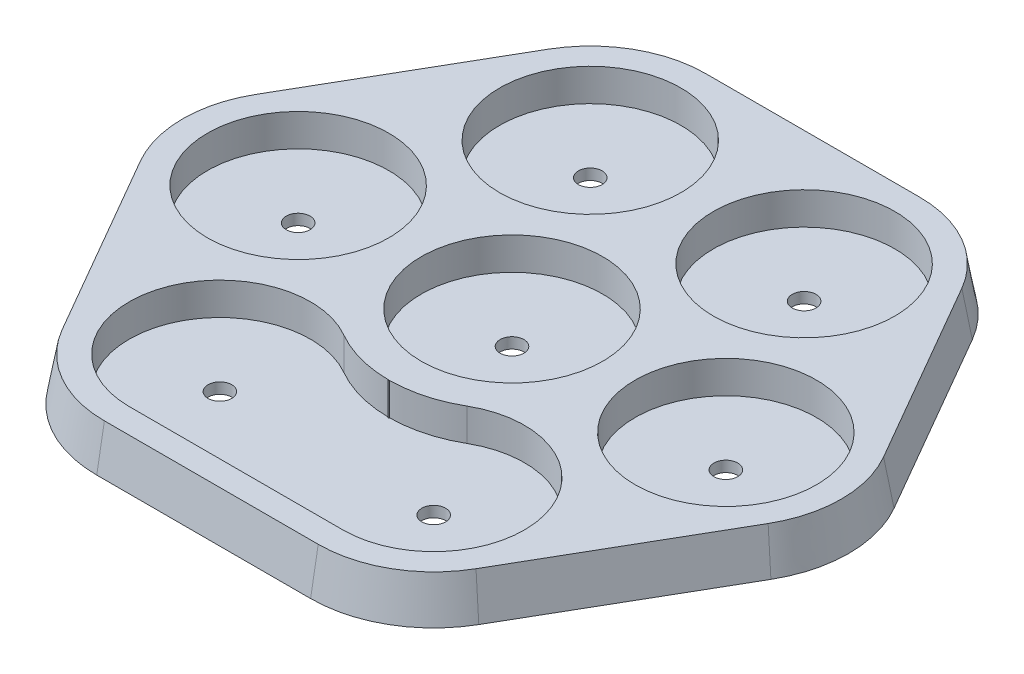
ISO-10303-21;
HEADER;
FILE_DESCRIPTION(('STEP AP214'),'2;1');
FILE_NAME('part.step','',(''),(''),'','','');
FILE_SCHEMA(('AUTOMOTIVE_DESIGN { 1 0 10303 214 1 1 1 1 }'));
ENDSEC;
DATA;
#1=APPLICATION_CONTEXT('core data for automotive mechanical design processes');
#2=APPLICATION_PROTOCOL_DEFINITION('international standard','automotive_design',2000,#1);
#3=PRODUCT_CONTEXT('',#1,'mechanical');
#4=PRODUCT('Part','Part','',(#3));
#5=PRODUCT_RELATED_PRODUCT_CATEGORY('part','',(#4));
#6=PRODUCT_DEFINITION_FORMATION('','',#4);
#7=PRODUCT_DEFINITION_CONTEXT('part definition',#1,'design');
#8=PRODUCT_DEFINITION('design','',#6,#7);
#9=PRODUCT_DEFINITION_SHAPE('','',#8);
#10=(LENGTH_UNIT() NAMED_UNIT(*) SI_UNIT(.MILLI.,.METRE.));
#11=(NAMED_UNIT(*) PLANE_ANGLE_UNIT() SI_UNIT($,.RADIAN.));
#12=(NAMED_UNIT(*) SI_UNIT($,.STERADIAN.) SOLID_ANGLE_UNIT());
#13=UNCERTAINTY_MEASURE_WITH_UNIT(LENGTH_MEASURE(1.E-05),#10,'distance_accuracy_value','');
#14=(GEOMETRIC_REPRESENTATION_CONTEXT(3) GLOBAL_UNCERTAINTY_ASSIGNED_CONTEXT((#13)) GLOBAL_UNIT_ASSIGNED_CONTEXT((#10,
#11,#12)) REPRESENTATION_CONTEXT('',''));
#15=CARTESIAN_POINT('',(0.,0.,0.));
#16=DIRECTION('',(0.,0.,1.));
#17=DIRECTION('',(1.,0.,0.));
#18=AXIS2_PLACEMENT_3D('',#15,#16,#17);
#19=CARTESIAN_POINT('',(0.,4.,0.));
#20=DIRECTION('',(0.,1.,0.));
#21=DIRECTION('',(0.,0.,1.));
#22=AXIS2_PLACEMENT_3D('',#19,#20,#21);
#23=PLANE('',#22);
#24=CARTESIAN_POINT('',(-39.5999999999999,4.,-2.72581957005969E-13));
#25=DIRECTION('',(0.,1.,0.));
#26=DIRECTION('',(0.,0.,1.));
#27=AXIS2_PLACEMENT_3D('',#24,#25,#26);
#28=CIRCLE('',#27,10.6946920771662);
#29=CARTESIAN_POINT('',(-48.8618750244777,4.,-5.34734603858365));
#30=VERTEX_POINT('',#29);
#31=CARTESIAN_POINT('',(-48.8618750244779,4.,5.3473460385827));
#32=VERTEX_POINT('',#31);
#33=EDGE_CURVE('E422',#30,#32,#28,.T.);
#34=ORIENTED_EDGE('',*,*,#33,.T.);
#35=DIRECTION('',(-0.499999999999992,0.,-0.866025403784443));
#36=VECTOR('',#35,1.);
#37=CARTESIAN_POINT('',(-38.9618750244782,4.,22.4946490335146));
#38=LINE('',#37,#36);
#39=CARTESIAN_POINT('',(-38.961875024478,4.,22.4946490335148));
#40=VERTEX_POINT('',#39);
#41=EDGE_CURVE('E463',#32,#40,#38,.F.);
#42=ORIENTED_EDGE('',*,*,#41,.T.);
#43=CARTESIAN_POINT('',(-29.6999999999999,4.,17.1473029949318));
#44=DIRECTION('',(0.,1.,0.));
#45=DIRECTION('',(0.,0.,1.));
#46=AXIS2_PLACEMENT_3D('',#43,#44,#45);
#47=CIRCLE('',#46,10.6946920771661);
#48=CARTESIAN_POINT('',(-29.6999999999999,4.,27.841995072098));
#49=VERTEX_POINT('',#48);
#50=EDGE_CURVE('E466',#40,#49,#47,.T.);
#51=ORIENTED_EDGE('',*,*,#50,.T.);
#52=DIRECTION('',(-1.,0.,0.));
#53=VECTOR('',#52,1.);
#54=CARTESIAN_POINT('',(0.,4.,27.841995072098));
#55=LINE('',#54,#53);
#56=CARTESIAN_POINT('',(-9.90000000000008,4.,27.841995072098));
#57=VERTEX_POINT('',#56);
#58=EDGE_CURVE('E469',#57,#49,#55,.T.);
#59=ORIENTED_EDGE('',*,*,#58,.F.);
#60=CARTESIAN_POINT('',(-9.90000000000008,4.,17.1473029949318));
#61=DIRECTION('',(0.,1.,0.));
#62=DIRECTION('',(0.,0.,1.));
#63=AXIS2_PLACEMENT_3D('',#60,#61,#62);
#64=CIRCLE('',#63,10.6946920771661);
#65=CARTESIAN_POINT('',(-0.63812497552206,4.,22.494649033515));
#66=VERTEX_POINT('',#65);
#67=EDGE_CURVE('E473',#57,#66,#64,.T.);
#68=ORIENTED_EDGE('',*,*,#67,.T.);
#69=DIRECTION('',(-0.500000000000004,0.,0.866025403784436));
#70=VECTOR('',#69,1.);
#71=CARTESIAN_POINT('',(9.26187502447802,4.,5.34734603858312));
#72=LINE('',#71,#70);
#73=CARTESIAN_POINT('',(9.26187502447802,4.,5.34734603858311));
#74=VERTEX_POINT('',#73);
#75=EDGE_CURVE('E476',#74,#66,#72,.T.);
#76=ORIENTED_EDGE('',*,*,#75,.F.);
#77=CARTESIAN_POINT('',(0.,4.,0.));
#78=DIRECTION('',(0.,1.,0.));
#79=DIRECTION('',(0.,0.,1.));
#80=AXIS2_PLACEMENT_3D('',#77,#78,#79);
#81=CIRCLE('',#80,10.6946920771661);
#82=CARTESIAN_POINT('',(9.26187502447801,4.,-5.34734603858311));
#83=VERTEX_POINT('',#82);
#84=EDGE_CURVE('E480',#74,#83,#81,.T.);
#85=ORIENTED_EDGE('',*,*,#84,.T.);
#86=DIRECTION('',(0.500000000000004,0.,0.866025403784436));
#87=VECTOR('',#86,1.);
#88=CARTESIAN_POINT('',(9.26187502447801,4.,-5.34734603858311));
#89=LINE('',#88,#87);
#90=CARTESIAN_POINT('',(-0.638124975521912,4.,-22.4946490335147));
#91=VERTEX_POINT('',#90);
#92=EDGE_CURVE('E483',#91,#83,#89,.T.);
#93=ORIENTED_EDGE('',*,*,#92,.F.);
#94=CARTESIAN_POINT('',(-9.89999999999992,4.,-17.1473029949316));
#95=DIRECTION('',(0.,1.,0.));
#96=DIRECTION('',(0.,0.,1.));
#97=AXIS2_PLACEMENT_3D('',#94,#95,#96);
#98=CIRCLE('',#97,10.6946920771661);
#99=CARTESIAN_POINT('',(-9.89999999999993,4.,-27.8419950720977));
#100=VERTEX_POINT('',#99);
#101=EDGE_CURVE('E487',#91,#100,#98,.T.);
#102=ORIENTED_EDGE('',*,*,#101,.T.);
#103=DIRECTION('',(1.,0.,0.));
#104=VECTOR('',#103,1.);
#105=CARTESIAN_POINT('',(2.04901295325575E-13,4.,-27.8419950720976));
#106=LINE('',#105,#104);
#107=CARTESIAN_POINT('',(-29.6999999999993,4.,-27.8419950720978));
#108=VERTEX_POINT('',#107);
#109=EDGE_CURVE('E490',#100,#108,#106,.F.);
#110=ORIENTED_EDGE('',*,*,#109,.T.);
#111=CARTESIAN_POINT('',(-29.6999999999994,4.,-17.1473029949317));
#112=DIRECTION('',(0.,1.,0.));
#113=DIRECTION('',(0.,0.,1.));
#114=AXIS2_PLACEMENT_3D('',#111,#112,#113);
#115=CIRCLE('',#114,10.6946920771661);
#116=CARTESIAN_POINT('',(-38.9618750244772,4.,-22.4946490335151));
#117=VERTEX_POINT('',#116);
#118=EDGE_CURVE('E492',#108,#117,#115,.T.);
#119=ORIENTED_EDGE('',*,*,#118,.T.);
#120=DIRECTION('',(0.500000000000028,0.,-0.866025403784422));
#121=VECTOR('',#120,1.);
#122=CARTESIAN_POINT('',(-38.9618750244768,4.,-22.4946490335159));
#123=LINE('',#122,#121);
#124=EDGE_CURVE('E123',#117,#30,#123,.F.);
#125=ORIENTED_EDGE('',*,*,#124,.T.);
#126=EDGE_LOOP('',(#34,#42,#51,#59,#68,#76,#85,#93,#102,#110,#119,#125));
#127=FACE_BOUND('',#126,.T.);
#128=CARTESIAN_POINT('',(-19.7999999999998,4.,0.));
#129=DIRECTION('',(0.,1.,0.));
#130=DIRECTION('',(0.,0.,1.));
#131=AXIS2_PLACEMENT_3D('',#128,#129,#130);
#132=CIRCLE('',#131,8.40000000000001);
#133=CARTESIAN_POINT('',(-19.7999999999998,4.,8.40000000000001));
#134=VERTEX_POINT('',#133);
#135=EDGE_CURVE('E343',#134,#134,#132,.T.);
#136=ORIENTED_EDGE('',*,*,#135,.F.);
#137=EDGE_LOOP('',(#136));
#138=FACE_BOUND('',#137,.T.);
#139=CARTESIAN_POINT('',(0.,4.,0.));
#140=DIRECTION('',(0.,1.,0.));
#141=DIRECTION('',(0.,0.,1.));
#142=AXIS2_PLACEMENT_3D('',#139,#140,#141);
#143=CIRCLE('',#142,8.4);
#144=CARTESIAN_POINT('',(0.,4.,8.4));
#145=VERTEX_POINT('',#144);
#146=EDGE_CURVE('E667',#145,#145,#143,.T.);
#147=ORIENTED_EDGE('',*,*,#146,.F.);
#148=EDGE_LOOP('',(#147));
#149=FACE_BOUND('',#148,.T.);
#150=CARTESIAN_POINT('',(-39.5999999999999,4.,-2.72581957005969E-13));
#151=DIRECTION('',(0.,1.,0.));
#152=DIRECTION('',(0.,0.,1.));
#153=AXIS2_PLACEMENT_3D('',#150,#151,#152);
#154=CIRCLE('',#153,8.40000000000002);
#155=CARTESIAN_POINT('',(-39.5999999999999,4.,8.39999999999974));
#156=VERTEX_POINT('',#155);
#157=EDGE_CURVE('E678',#156,#156,#154,.T.);
#158=ORIENTED_EDGE('',*,*,#157,.F.);
#159=EDGE_LOOP('',(#158));
#160=FACE_BOUND('',#159,.T.);
#161=CARTESIAN_POINT('',(-9.89999999999992,4.,-17.1473029949316));
#162=DIRECTION('',(0.,1.,0.));
#163=DIRECTION('',(0.,0.,1.));
#164=AXIS2_PLACEMENT_3D('',#161,#162,#163);
#165=CIRCLE('',#164,8.4);
#166=CARTESIAN_POINT('',(-9.89999999999992,4.,-8.74730299493156));
#167=VERTEX_POINT('',#166);
#168=EDGE_CURVE('E691',#167,#167,#165,.T.);
#169=ORIENTED_EDGE('',*,*,#168,.F.);
#170=EDGE_LOOP('',(#169));
#171=FACE_BOUND('',#170,.T.);
#172=CARTESIAN_POINT('',(-29.6999999999994,4.,-17.1473029949317));
#173=DIRECTION('',(0.,1.,0.));
#174=DIRECTION('',(0.,0.,1.));
#175=AXIS2_PLACEMENT_3D('',#172,#173,#174);
#176=CIRCLE('',#175,8.39999999999999);
#177=CARTESIAN_POINT('',(-29.6999999999994,4.,-8.74730299493172));
#178=VERTEX_POINT('',#177);
#179=EDGE_CURVE('E702',#178,#178,#176,.T.);
#180=ORIENTED_EDGE('',*,*,#179,.F.);
#181=EDGE_LOOP('',(#180));
#182=FACE_BOUND('',#181,.T.);
#183=CARTESIAN_POINT('',(-29.6999999999999,4.,17.1473029949318));
#184=DIRECTION('',(0.,1.,0.));
#185=DIRECTION('',(0.,0.,1.));
#186=AXIS2_PLACEMENT_3D('',#183,#184,#185);
#187=CIRCLE('',#186,8.4);
#188=CARTESIAN_POINT('',(-25.4999999999999,4.,9.87268960314258));
#189=VERTEX_POINT('',#188);
#190=CARTESIAN_POINT('',(-29.6999999999999,4.,25.5473029949318));
#191=VERTEX_POINT('',#190);
#192=EDGE_CURVE('E263',#189,#191,#187,.T.);
#193=ORIENTED_EDGE('',*,*,#192,.F.);
#194=CARTESIAN_POINT('',(-19.7999999999998,4.,0.));
#195=DIRECTION('',(0.,1.,0.));
#196=DIRECTION('',(0.,0.,1.));
#197=AXIS2_PLACEMENT_3D('',#194,#195,#196);
#198=CIRCLE('',#197,11.4);
#199=CARTESIAN_POINT('',(-19.8548493383757,4.,11.3998680496785));
#200=VERTEX_POINT('',#199);
#201=EDGE_CURVE('E137',#189,#200,#198,.T.);
#202=ORIENTED_EDGE('',*,*,#201,.T.);
#203=CARTESIAN_POINT('',(-29.6999999999999,4.,17.1473029949318));
#204=DIRECTION('',(0.,1.,0.));
#205=DIRECTION('',(0.,0.,1.));
#206=AXIS2_PLACEMENT_3D('',#203,#204,#205);
#207=CIRCLE('',#206,11.4);
#208=CARTESIAN_POINT('',(-19.8,4.,11.4948698905067));
#209=VERTEX_POINT('',#208);
#210=EDGE_CURVE('E270',#209,#200,#207,.T.);
#211=ORIENTED_EDGE('',*,*,#210,.F.);
#212=CARTESIAN_POINT('',(-9.90000000000008,4.,17.1473029949318));
#213=DIRECTION('',(0.,1.,0.));
#214=DIRECTION('',(0.,0.,1.));
#215=AXIS2_PLACEMENT_3D('',#212,#213,#214);
#216=CIRCLE('',#215,11.4);
#217=CARTESIAN_POINT('',(-19.7451506616243,4.,11.3998680496785));
#218=VERTEX_POINT('',#217);
#219=EDGE_CURVE('E304',#218,#209,#216,.T.);
#220=ORIENTED_EDGE('',*,*,#219,.F.);
#221=CARTESIAN_POINT('',(-19.7999999999998,4.,0.));
#222=DIRECTION('',(0.,1.,0.));
#223=DIRECTION('',(0.,0.,1.));
#224=AXIS2_PLACEMENT_3D('',#221,#222,#223);
#225=CIRCLE('',#224,11.4);
#226=CARTESIAN_POINT('',(-14.0999999999999,4.,9.87268960314266));
#227=VERTEX_POINT('',#226);
#228=EDGE_CURVE('E308',#218,#227,#225,.T.);
#229=ORIENTED_EDGE('',*,*,#228,.T.);
#230=CARTESIAN_POINT('',(-9.90000000000008,4.,17.1473029949318));
#231=DIRECTION('',(0.,1.,0.));
#232=DIRECTION('',(0.,0.,1.));
#233=AXIS2_PLACEMENT_3D('',#230,#231,#232);
#234=CIRCLE('',#233,8.4);
#235=CARTESIAN_POINT('',(-9.90000000000008,4.,25.5473029949318));
#236=VERTEX_POINT('',#235);
#237=EDGE_CURVE('E312',#236,#227,#234,.T.);
#238=ORIENTED_EDGE('',*,*,#237,.F.);
#239=DIRECTION('',(1.,0.,0.));
#240=VECTOR('',#239,1.);
#241=CARTESIAN_POINT('',(0.,4.,25.5473029949319));
#242=LINE('',#241,#240);
#243=EDGE_CURVE('E316',#191,#236,#242,.T.);
#244=ORIENTED_EDGE('',*,*,#243,.F.);
#245=EDGE_LOOP('',(#193,#202,#211,#220,#229,#238,#244));
#246=FACE_BOUND('',#245,.T.);
#247=ADVANCED_FACE('F119',(#127,#138,#149,#160,#171,#182,#246),#23,.T.);
#248=CARTESIAN_POINT('',(-9.90000000000008,0.,17.1473029949318));
#249=DIRECTION('',(0.,1.,0.));
#250=DIRECTION('',(0.,0.,1.));
#251=AXIS2_PLACEMENT_3D('',#248,#249,#250);
#252=CYLINDRICAL_SURFACE('',#251,1.1);
#253=CARTESIAN_POINT('',(-9.90000000000008,0.,17.1473029949318));
#254=DIRECTION('',(0.,1.,0.));
#255=DIRECTION('',(0.,0.,1.));
#256=AXIS2_PLACEMENT_3D('',#253,#254,#255);
#257=CIRCLE('',#256,1.1);
#258=CARTESIAN_POINT('',(-9.90000000000008,0.,18.2473029949318));
#259=VERTEX_POINT('',#258);
#260=EDGE_CURVE('E373',#259,#259,#257,.T.);
#261=ORIENTED_EDGE('',*,*,#260,.F.);
#262=EDGE_LOOP('',(#261));
#263=FACE_BOUND('',#262,.T.);
#264=CARTESIAN_POINT('',(-9.90000000000008,1.,17.1473029949318));
#265=DIRECTION('',(0.,1.,0.));
#266=DIRECTION('',(0.,0.,1.));
#267=AXIS2_PLACEMENT_3D('',#264,#265,#266);
#268=CIRCLE('',#267,1.1);
#269=CARTESIAN_POINT('',(-9.90000000000008,1.,18.2473029949318));
#270=VERTEX_POINT('',#269);
#271=EDGE_CURVE('E709',#270,#270,#268,.T.);
#272=ORIENTED_EDGE('',*,*,#271,.T.);
#273=EDGE_LOOP('',(#272));
#274=FACE_BOUND('',#273,.T.);
#275=ADVANCED_FACE('F566',(#263,#274),#252,.F.);
#276=CARTESIAN_POINT('',(-19.7999999999998,0.,0.));
#277=DIRECTION('',(0.,1.,0.));
#278=DIRECTION('',(0.,0.,1.));
#279=AXIS2_PLACEMENT_3D('',#276,#277,#278);
#280=CYLINDRICAL_SURFACE('',#279,1.10000000000001);
#281=CARTESIAN_POINT('',(-19.7999999999998,0.,0.));
#282=DIRECTION('',(0.,1.,0.));
#283=DIRECTION('',(0.,0.,1.));
#284=AXIS2_PLACEMENT_3D('',#281,#282,#283);
#285=CIRCLE('',#284,1.10000000000001);
#286=CARTESIAN_POINT('',(-19.7999999999998,0.,1.10000000000001));
#287=VERTEX_POINT('',#286);
#288=EDGE_CURVE('E349',#287,#287,#285,.T.);
#289=ORIENTED_EDGE('',*,*,#288,.F.);
#290=EDGE_LOOP('',(#289));
#291=FACE_BOUND('',#290,.T.);
#292=CARTESIAN_POINT('',(-19.7999999999998,1.,0.));
#293=DIRECTION('',(0.,1.,0.));
#294=DIRECTION('',(0.,0.,1.));
#295=AXIS2_PLACEMENT_3D('',#292,#293,#294);
#296=CIRCLE('',#295,1.10000000000001);
#297=CARTESIAN_POINT('',(-19.7999999999998,1.,1.10000000000001));
#298=VERTEX_POINT('',#297);
#299=EDGE_CURVE('E339',#298,#298,#296,.T.);
#300=ORIENTED_EDGE('',*,*,#299,.T.);
#301=EDGE_LOOP('',(#300));
#302=FACE_BOUND('',#301,.T.);
#303=ADVANCED_FACE('F570',(#291,#302),#280,.F.);
#304=CARTESIAN_POINT('',(-29.6999999999994,0.,-17.1473029949317));
#305=DIRECTION('',(0.,1.,0.));
#306=DIRECTION('',(0.,0.,1.));
#307=AXIS2_PLACEMENT_3D('',#304,#305,#306);
#308=CYLINDRICAL_SURFACE('',#307,1.1);
#309=CARTESIAN_POINT('',(-29.6999999999994,0.,-17.1473029949317));
#310=DIRECTION('',(0.,1.,0.));
#311=DIRECTION('',(0.,0.,1.));
#312=AXIS2_PLACEMENT_3D('',#309,#310,#311);
#313=CIRCLE('',#312,1.1);
#314=CARTESIAN_POINT('',(-29.6999999999994,0.,-16.0473029949317));
#315=VERTEX_POINT('',#314);
#316=EDGE_CURVE('E353',#315,#315,#313,.T.);
#317=ORIENTED_EDGE('',*,*,#316,.F.);
#318=EDGE_LOOP('',(#317));
#319=FACE_BOUND('',#318,.T.);
#320=CARTESIAN_POINT('',(-29.6999999999994,1.,-17.1473029949317));
#321=DIRECTION('',(0.,1.,0.));
#322=DIRECTION('',(0.,0.,1.));
#323=AXIS2_PLACEMENT_3D('',#320,#321,#322);
#324=CIRCLE('',#323,1.1);
#325=CARTESIAN_POINT('',(-29.6999999999994,1.,-16.0473029949317));
#326=VERTEX_POINT('',#325);
#327=EDGE_CURVE('E272',#326,#326,#324,.T.);
#328=ORIENTED_EDGE('',*,*,#327,.T.);
#329=EDGE_LOOP('',(#328));
#330=FACE_BOUND('',#329,.T.);
#331=ADVANCED_FACE('F582',(#319,#330),#308,.F.);
#332=CARTESIAN_POINT('',(0.,0.,0.));
#333=DIRECTION('',(0.,1.,0.));
#334=DIRECTION('',(0.,0.,1.));
#335=AXIS2_PLACEMENT_3D('',#332,#333,#334);
#336=CYLINDRICAL_SURFACE('',#335,1.1);
#337=CARTESIAN_POINT('',(0.,0.,0.));
#338=DIRECTION('',(0.,1.,0.));
#339=DIRECTION('',(0.,0.,1.));
#340=AXIS2_PLACEMENT_3D('',#337,#338,#339);
#341=CIRCLE('',#340,1.1);
#342=CARTESIAN_POINT('',(0.,0.,1.1));
#343=VERTEX_POINT('',#342);
#344=EDGE_CURVE('E369',#343,#343,#341,.T.);
#345=ORIENTED_EDGE('',*,*,#344,.F.);
#346=EDGE_LOOP('',(#345));
#347=FACE_BOUND('',#346,.T.);
#348=CARTESIAN_POINT('',(0.,1.,0.));
#349=DIRECTION('',(0.,1.,0.));
#350=DIRECTION('',(0.,0.,1.));
#351=AXIS2_PLACEMENT_3D('',#348,#349,#350);
#352=CIRCLE('',#351,1.1);
#353=CARTESIAN_POINT('',(0.,1.,1.1));
#354=VERTEX_POINT('',#353);
#355=EDGE_CURVE('E663',#354,#354,#352,.T.);
#356=ORIENTED_EDGE('',*,*,#355,.T.);
#357=EDGE_LOOP('',(#356));
#358=FACE_BOUND('',#357,.T.);
#359=ADVANCED_FACE('F578',(#347,#358),#336,.F.);
#360=CARTESIAN_POINT('',(-29.6999999999999,0.,17.1473029949318));
#361=DIRECTION('',(0.,1.,0.));
#362=DIRECTION('',(0.,0.,1.));
#363=AXIS2_PLACEMENT_3D('',#360,#361,#362);
#364=CYLINDRICAL_SURFACE('',#363,1.1);
#365=CARTESIAN_POINT('',(-29.6999999999999,0.,17.1473029949318));
#366=DIRECTION('',(0.,1.,0.));
#367=DIRECTION('',(0.,0.,1.));
#368=AXIS2_PLACEMENT_3D('',#365,#366,#367);
#369=CIRCLE('',#368,1.1);
#370=CARTESIAN_POINT('',(-29.6999999999999,0.,18.2473029949318));
#371=VERTEX_POINT('',#370);
#372=EDGE_CURVE('E365',#371,#371,#369,.T.);
#373=ORIENTED_EDGE('',*,*,#372,.F.);
#374=EDGE_LOOP('',(#373));
#375=FACE_BOUND('',#374,.T.);
#376=CARTESIAN_POINT('',(-29.6999999999999,1.,17.1473029949318));
#377=DIRECTION('',(0.,1.,0.));
#378=DIRECTION('',(0.,0.,1.));
#379=AXIS2_PLACEMENT_3D('',#376,#377,#378);
#380=CIRCLE('',#379,1.1);
#381=CARTESIAN_POINT('',(-29.6999999999999,1.,18.2473029949318));
#382=VERTEX_POINT('',#381);
#383=EDGE_CURVE('E301',#382,#382,#380,.T.);
#384=ORIENTED_EDGE('',*,*,#383,.T.);
#385=EDGE_LOOP('',(#384));
#386=FACE_BOUND('',#385,.T.);
#387=ADVANCED_FACE('F574',(#375,#386),#364,.F.);
#388=CARTESIAN_POINT('',(-39.5999999999999,0.,-2.72581957005969E-13));
#389=DIRECTION('',(0.,1.,0.));
#390=DIRECTION('',(0.,0.,1.));
#391=AXIS2_PLACEMENT_3D('',#388,#389,#390);
#392=CYLINDRICAL_SURFACE('',#391,1.10000000000001);
#393=CARTESIAN_POINT('',(-39.5999999999999,0.,-2.72581957005969E-13));
#394=DIRECTION('',(0.,1.,0.));
#395=DIRECTION('',(0.,0.,1.));
#396=AXIS2_PLACEMENT_3D('',#393,#394,#395);
#397=CIRCLE('',#396,1.10000000000001);
#398=CARTESIAN_POINT('',(-39.5999999999999,0.,1.09999999999974));
#399=VERTEX_POINT('',#398);
#400=EDGE_CURVE('E361',#399,#399,#397,.T.);
#401=ORIENTED_EDGE('',*,*,#400,.F.);
#402=EDGE_LOOP('',(#401));
#403=FACE_BOUND('',#402,.T.);
#404=CARTESIAN_POINT('',(-39.5999999999999,1.,-2.72581957005969E-13));
#405=DIRECTION('',(0.,1.,0.));
#406=DIRECTION('',(0.,0.,1.));
#407=AXIS2_PLACEMENT_3D('',#404,#405,#406);
#408=CIRCLE('',#407,1.10000000000001);
#409=CARTESIAN_POINT('',(-39.5999999999999,1.,1.09999999999974));
#410=VERTEX_POINT('',#409);
#411=EDGE_CURVE('E674',#410,#410,#408,.T.);
#412=ORIENTED_EDGE('',*,*,#411,.T.);
#413=EDGE_LOOP('',(#412));
#414=FACE_BOUND('',#413,.T.);
#415=ADVANCED_FACE('F577',(#403,#414),#392,.F.);
#416=CARTESIAN_POINT('',(-9.89999999999992,0.,-17.1473029949316));
#417=DIRECTION('',(0.,1.,0.));
#418=DIRECTION('',(0.,0.,1.));
#419=AXIS2_PLACEMENT_3D('',#416,#417,#418);
#420=CYLINDRICAL_SURFACE('',#419,1.1);
#421=CARTESIAN_POINT('',(-9.89999999999992,0.,-17.1473029949316));
#422=DIRECTION('',(0.,1.,0.));
#423=DIRECTION('',(0.,0.,1.));
#424=AXIS2_PLACEMENT_3D('',#421,#422,#423);
#425=CIRCLE('',#424,1.1);
#426=CARTESIAN_POINT('',(-9.89999999999992,0.,-16.0473029949316));
#427=VERTEX_POINT('',#426);
#428=EDGE_CURVE('E357',#427,#427,#425,.T.);
#429=ORIENTED_EDGE('',*,*,#428,.F.);
#430=EDGE_LOOP('',(#429));
#431=FACE_BOUND('',#430,.T.);
#432=CARTESIAN_POINT('',(-9.89999999999992,1.,-17.1473029949316));
#433=DIRECTION('',(0.,1.,0.));
#434=DIRECTION('',(0.,0.,1.));
#435=AXIS2_PLACEMENT_3D('',#432,#433,#434);
#436=CIRCLE('',#435,1.1);
#437=CARTESIAN_POINT('',(-9.89999999999992,1.,-16.0473029949316));
#438=VERTEX_POINT('',#437);
#439=EDGE_CURVE('E687',#438,#438,#436,.T.);
#440=ORIENTED_EDGE('',*,*,#439,.T.);
#441=EDGE_LOOP('',(#440));
#442=FACE_BOUND('',#441,.T.);
#443=ADVANCED_FACE('F584',(#431,#442),#420,.F.);
#444=CARTESIAN_POINT('',(-39.5999999999999,0.,-2.72581957005969E-13));
#445=DIRECTION('',(0.,-1.,0.));
#446=DIRECTION('',(0.,0.,1.));
#447=AXIS2_PLACEMENT_3D('',#444,#445,#446);
#448=CONICAL_SURFACE('',#447,11.4,0.174532925199433);
#449=CARTESIAN_POINT('',(-39.5999999999999,0.,-2.72581957005969E-13));
#450=DIRECTION('',(0.,1.,0.));
#451=DIRECTION('',(0.,0.,1.));
#452=AXIS2_PLACEMENT_3D('',#449,#450,#451);
#453=CIRCLE('',#452,11.4);
#454=CARTESIAN_POINT('',(-49.4726896031423,0.,-5.7000000000006));
#455=VERTEX_POINT('',#454);
#456=CARTESIAN_POINT('',(-49.4726896031425,0.,5.69999999999964));
#457=VERTEX_POINT('',#456);
#458=EDGE_CURVE('E380',#455,#457,#453,.T.);
#459=ORIENTED_EDGE('',*,*,#458,.T.);
#460=DIRECTION('',(-0.150383733180436,-0.984807753012208,0.086824088833464));
#461=VECTOR('',#460,1.);
#462=CARTESIAN_POINT('',(-49.4726896031425,0.,5.69999999999963));
#463=LINE('',#462,#461);
#464=EDGE_CURVE('E12',#32,#457,#463,.T.);
#465=ORIENTED_EDGE('',*,*,#464,.F.);
#466=ORIENTED_EDGE('',*,*,#33,.F.);
#467=DIRECTION('',(-0.150383733180433,-0.984807753012208,-0.0868240888334703));
#468=VECTOR('',#467,1.);
#469=CARTESIAN_POINT('',(-49.4726896031423,0.,-5.7000000000006));
#470=LINE('',#469,#468);
#471=EDGE_CURVE('E424',#30,#455,#470,.T.);
#472=ORIENTED_EDGE('',*,*,#471,.T.);
#473=EDGE_LOOP('',(#459,#465,#466,#472));
#474=FACE_BOUND('',#473,.T.);
#475=ADVANCED_FACE('F510',(#474),#448,.T.);
#476=CARTESIAN_POINT('',(-39.5726896031427,0.,22.8473029949315));
#477=DIRECTION('',(-0.852868531952448,0.173648177666931,0.492403876506096));
#478=DIRECTION('',(0.499999999999992,0.,0.866025403784443));
#479=AXIS2_PLACEMENT_3D('',#476,#477,#478);
#480=PLANE('',#479);
#481=DIRECTION('',(0.499999999999992,0.,0.866025403784443));
#482=VECTOR('',#481,1.);
#483=CARTESIAN_POINT('',(-39.5726896031427,0.,22.8473029949315));
#484=LINE('',#483,#482);
#485=CARTESIAN_POINT('',(-39.5726896031426,0.,22.8473029949318));
#486=VERTEX_POINT('',#485);
#487=EDGE_CURVE('E384',#457,#486,#484,.T.);
#488=ORIENTED_EDGE('',*,*,#487,.T.);
#489=DIRECTION('',(-0.150383733180436,-0.984807753012208,0.086824088833464));
#490=VECTOR('',#489,1.);
#491=CARTESIAN_POINT('',(-39.5726896031426,0.,22.8473029949318));
#492=LINE('',#491,#490);
#493=EDGE_CURVE('E129',#40,#486,#492,.T.);
#494=ORIENTED_EDGE('',*,*,#493,.F.);
#495=ORIENTED_EDGE('',*,*,#41,.F.);
#496=ORIENTED_EDGE('',*,*,#464,.T.);
#497=EDGE_LOOP('',(#488,#494,#495,#496));
#498=FACE_BOUND('',#497,.T.);
#499=ADVANCED_FACE('F121',(#498),#480,.T.);
#500=CARTESIAN_POINT('',(-29.6999999999999,0.,17.1473029949318));
#501=DIRECTION('',(0.,-1.,0.));
#502=DIRECTION('',(0.,0.,1.));
#503=AXIS2_PLACEMENT_3D('',#500,#501,#502);
#504=CONICAL_SURFACE('',#503,11.4,0.174532925199433);
#505=CARTESIAN_POINT('',(-29.6999999999999,0.,17.1473029949318));
#506=DIRECTION('',(0.,1.,0.));
#507=DIRECTION('',(0.,0.,1.));
#508=AXIS2_PLACEMENT_3D('',#505,#506,#507);
#509=CIRCLE('',#508,11.4);
#510=CARTESIAN_POINT('',(-29.6999999999999,0.,28.5473029949318));
#511=VERTEX_POINT('',#510);
#512=EDGE_CURVE('E387',#486,#511,#509,.T.);
#513=ORIENTED_EDGE('',*,*,#512,.T.);
#514=DIRECTION('',(0.,-0.984807753012208,0.173648177666931));
#515=VECTOR('',#514,1.);
#516=CARTESIAN_POINT('',(-29.6999999999999,0.,28.5473029949318));
#517=LINE('',#516,#515);
#518=EDGE_CURVE('E455',#49,#511,#517,.T.);
#519=ORIENTED_EDGE('',*,*,#518,.F.);
#520=ORIENTED_EDGE('',*,*,#50,.F.);
#521=ORIENTED_EDGE('',*,*,#493,.T.);
#522=EDGE_LOOP('',(#513,#519,#520,#521));
#523=FACE_BOUND('',#522,.T.);
#524=ADVANCED_FACE('F518',(#523),#504,.T.);
#525=CARTESIAN_POINT('',(0.,0.,28.5473029949318));
#526=DIRECTION('',(0.,0.173648177666931,0.984807753012208));
#527=DIRECTION('',(0.,-0.984807753012208,0.173648177666931));
#528=AXIS2_PLACEMENT_3D('',#525,#526,#527);
#529=PLANE('',#528);
#530=DIRECTION('',(-1.,0.,0.));
#531=VECTOR('',#530,1.);
#532=CARTESIAN_POINT('',(0.,0.,28.5473029949318));
#533=LINE('',#532,#531);
#534=CARTESIAN_POINT('',(-9.90000000000008,0.,28.5473029949318));
#535=VERTEX_POINT('',#534);
#536=EDGE_CURVE('E391',#535,#511,#533,.T.);
#537=ORIENTED_EDGE('',*,*,#536,.F.);
#538=DIRECTION('',(0.,-0.984807753012208,0.173648177666931));
#539=VECTOR('',#538,1.);
#540=CARTESIAN_POINT('',(-9.90000000000008,0.,28.5473029949318));
#541=LINE('',#540,#539);
#542=EDGE_CURVE('E452',#57,#535,#541,.T.);
#543=ORIENTED_EDGE('',*,*,#542,.F.);
#544=ORIENTED_EDGE('',*,*,#58,.T.);
#545=ORIENTED_EDGE('',*,*,#518,.T.);
#546=EDGE_LOOP('',(#537,#543,#544,#545));
#547=FACE_BOUND('',#546,.T.);
#548=ADVANCED_FACE('F521',(#547),#529,.T.);
#549=CARTESIAN_POINT('',(-9.90000000000008,0.,17.1473029949318));
#550=DIRECTION('',(0.,-1.,0.));
#551=DIRECTION('',(0.,0.,1.));
#552=AXIS2_PLACEMENT_3D('',#549,#550,#551);
#553=CONICAL_SURFACE('',#552,11.4,0.174532925199433);
#554=CARTESIAN_POINT('',(-9.90000000000008,0.,17.1473029949318));
#555=DIRECTION('',(0.,1.,0.));
#556=DIRECTION('',(0.,0.,1.));
#557=AXIS2_PLACEMENT_3D('',#554,#555,#556);
#558=CIRCLE('',#557,11.4);
#559=CARTESIAN_POINT('',(-0.0273103968575052,0.,22.8473029949319));
#560=VERTEX_POINT('',#559);
#561=EDGE_CURVE('E395',#535,#560,#558,.T.);
#562=ORIENTED_EDGE('',*,*,#561,.T.);
#563=DIRECTION('',(0.150383733180435,-0.984807753012208,0.0868240888334661));
#564=VECTOR('',#563,1.);
#565=CARTESIAN_POINT('',(-0.0273103968575027,0.,22.8473029949319));
#566=LINE('',#565,#564);
#567=EDGE_CURVE('E449',#66,#560,#566,.T.);
#568=ORIENTED_EDGE('',*,*,#567,.F.);
#569=ORIENTED_EDGE('',*,*,#67,.F.);
#570=ORIENTED_EDGE('',*,*,#542,.T.);
#571=EDGE_LOOP('',(#562,#568,#569,#570));
#572=FACE_BOUND('',#571,.T.);
#573=ADVANCED_FACE('F526',(#572),#553,.T.);
#574=CARTESIAN_POINT('',(9.87268960314258,0.,5.70000000000005));
#575=DIRECTION('',(0.852868531952441,0.173648177666931,0.492403876506108));
#576=DIRECTION('',(0.500000000000004,0.,-0.866025403784436));
#577=AXIS2_PLACEMENT_3D('',#574,#575,#576);
#578=PLANE('',#577);
#579=DIRECTION('',(-0.500000000000004,0.,0.866025403784436));
#580=VECTOR('',#579,1.);
#581=CARTESIAN_POINT('',(9.87268960314258,0.,5.70000000000005));
#582=LINE('',#581,#580);
#583=CARTESIAN_POINT('',(9.87268960314258,0.,5.70000000000005));
#584=VERTEX_POINT('',#583);
#585=EDGE_CURVE('E399',#584,#560,#582,.T.);
#586=ORIENTED_EDGE('',*,*,#585,.F.);
#587=DIRECTION('',(0.150383733180435,-0.984807753012208,0.0868240888334661));
#588=VECTOR('',#587,1.);
#589=CARTESIAN_POINT('',(9.87268960314258,0.,5.70000000000004));
#590=LINE('',#589,#588);
#591=EDGE_CURVE('E446',#74,#584,#590,.T.);
#592=ORIENTED_EDGE('',*,*,#591,.F.);
#593=ORIENTED_EDGE('',*,*,#75,.T.);
#594=ORIENTED_EDGE('',*,*,#567,.T.);
#595=EDGE_LOOP('',(#586,#592,#593,#594));
#596=FACE_BOUND('',#595,.T.);
#597=ADVANCED_FACE('F530',(#596),#578,.T.);
#598=CARTESIAN_POINT('',(0.,0.,0.));
#599=DIRECTION('',(0.,-1.,0.));
#600=DIRECTION('',(0.,0.,1.));
#601=AXIS2_PLACEMENT_3D('',#598,#599,#600);
#602=CONICAL_SURFACE('',#601,11.4,0.174532925199433);
#603=CARTESIAN_POINT('',(0.,0.,0.));
#604=DIRECTION('',(0.,1.,0.));
#605=DIRECTION('',(0.,0.,1.));
#606=AXIS2_PLACEMENT_3D('',#603,#604,#605);
#607=CIRCLE('',#606,11.4);
#608=CARTESIAN_POINT('',(9.87268960314257,0.,-5.70000000000005));
#609=VERTEX_POINT('',#608);
#610=EDGE_CURVE('E403',#584,#609,#607,.T.);
#611=ORIENTED_EDGE('',*,*,#610,.T.);
#612=DIRECTION('',(0.150383733180435,-0.984807753012208,-0.0868240888334661));
#613=VECTOR('',#612,1.);
#614=CARTESIAN_POINT('',(9.87268960314257,0.,-5.70000000000005));
#615=LINE('',#614,#613);
#616=EDGE_CURVE('E443',#83,#609,#615,.T.);
#617=ORIENTED_EDGE('',*,*,#616,.F.);
#618=ORIENTED_EDGE('',*,*,#84,.F.);
#619=ORIENTED_EDGE('',*,*,#591,.T.);
#620=EDGE_LOOP('',(#611,#617,#618,#619));
#621=FACE_BOUND('',#620,.T.);
#622=ADVANCED_FACE('F535',(#621),#602,.T.);
#623=CARTESIAN_POINT('',(9.87268960314257,0.,-5.70000000000005));
#624=DIRECTION('',(0.852868531952441,0.173648177666931,-0.492403876506108));
#625=DIRECTION('',(-0.500000000000004,0.,-0.866025403784436));
#626=AXIS2_PLACEMENT_3D('',#623,#624,#625);
#627=PLANE('',#626);
#628=DIRECTION('',(0.500000000000004,0.,0.866025403784436));
#629=VECTOR('',#628,1.);
#630=CARTESIAN_POINT('',(9.87268960314257,0.,-5.70000000000005));
#631=LINE('',#630,#629);
#632=CARTESIAN_POINT('',(-0.0273103968573551,0.,-22.8473029949316));
#633=VERTEX_POINT('',#632);
#634=EDGE_CURVE('E407',#633,#609,#631,.T.);
#635=ORIENTED_EDGE('',*,*,#634,.F.);
#636=DIRECTION('',(0.150383733180435,-0.984807753012208,-0.0868240888334661));
#637=VECTOR('',#636,1.);
#638=CARTESIAN_POINT('',(-0.0273103968573551,0.,-22.8473029949316));
#639=LINE('',#638,#637);
#640=EDGE_CURVE('E440',#91,#633,#639,.T.);
#641=ORIENTED_EDGE('',*,*,#640,.F.);
#642=ORIENTED_EDGE('',*,*,#92,.T.);
#643=ORIENTED_EDGE('',*,*,#616,.T.);
#644=EDGE_LOOP('',(#635,#641,#642,#643));
#645=FACE_BOUND('',#644,.T.);
#646=ADVANCED_FACE('F541',(#645),#627,.T.);
#647=CARTESIAN_POINT('',(-9.89999999999992,0.,-17.1473029949316));
#648=DIRECTION('',(0.,-1.,0.));
#649=DIRECTION('',(0.,0.,1.));
#650=AXIS2_PLACEMENT_3D('',#647,#648,#649);
#651=CONICAL_SURFACE('',#650,11.4,0.174532925199433);
#652=CARTESIAN_POINT('',(-9.89999999999992,0.,-17.1473029949316));
#653=DIRECTION('',(0.,1.,0.));
#654=DIRECTION('',(0.,0.,1.));
#655=AXIS2_PLACEMENT_3D('',#652,#653,#654);
#656=CIRCLE('',#655,11.4);
#657=CARTESIAN_POINT('',(-9.89999999999992,0.,-28.5473029949316));
#658=VERTEX_POINT('',#657);
#659=EDGE_CURVE('E411',#633,#658,#656,.T.);
#660=ORIENTED_EDGE('',*,*,#659,.T.);
#661=DIRECTION('',(0.,-0.984807753012208,-0.173648177666931));
#662=VECTOR('',#661,1.);
#663=CARTESIAN_POINT('',(-9.89999999999992,0.,-28.5473029949316));
#664=LINE('',#663,#662);
#665=EDGE_CURVE('E436',#100,#658,#664,.T.);
#666=ORIENTED_EDGE('',*,*,#665,.F.);
#667=ORIENTED_EDGE('',*,*,#101,.F.);
#668=ORIENTED_EDGE('',*,*,#640,.T.);
#669=EDGE_LOOP('',(#660,#666,#667,#668));
#670=FACE_BOUND('',#669,.T.);
#671=ADVANCED_FACE('F544',(#670),#651,.T.);
#672=CARTESIAN_POINT('',(2.10091961677531E-13,0.,-28.5473029949315));
#673=DIRECTION('',(0.,0.173648177666931,-0.984807753012208));
#674=DIRECTION('',(0.,0.984807753012208,0.173648177666931));
#675=AXIS2_PLACEMENT_3D('',#672,#673,#674);
#676=PLANE('',#675);
#677=DIRECTION('',(-1.,0.,0.));
#678=VECTOR('',#677,1.);
#679=CARTESIAN_POINT('',(2.10091961677531E-13,0.,-28.5473029949315));
#680=LINE('',#679,#678);
#681=CARTESIAN_POINT('',(-29.6999999999993,0.,-28.5473029949317));
#682=VERTEX_POINT('',#681);
#683=EDGE_CURVE('E414',#658,#682,#680,.T.);
#684=ORIENTED_EDGE('',*,*,#683,.T.);
#685=DIRECTION('',(0.,-0.984807753012208,-0.173648177666931));
#686=VECTOR('',#685,1.);
#687=CARTESIAN_POINT('',(-29.6999999999993,0.,-28.5473029949317));
#688=LINE('',#687,#686);
#689=EDGE_CURVE('E432',#108,#682,#688,.T.);
#690=ORIENTED_EDGE('',*,*,#689,.F.);
#691=ORIENTED_EDGE('',*,*,#109,.F.);
#692=ORIENTED_EDGE('',*,*,#665,.T.);
#693=EDGE_LOOP('',(#684,#690,#691,#692));
#694=FACE_BOUND('',#693,.T.);
#695=ADVANCED_FACE('F547',(#694),#676,.T.);
#696=CARTESIAN_POINT('',(-29.6999999999994,0.,-17.1473029949317));
#697=DIRECTION('',(0.,-1.,0.));
#698=DIRECTION('',(0.,0.,1.));
#699=AXIS2_PLACEMENT_3D('',#696,#697,#698);
#700=CONICAL_SURFACE('',#699,11.4,0.174532925199433);
#701=CARTESIAN_POINT('',(-29.6999999999994,0.,-17.1473029949317));
#702=DIRECTION('',(0.,1.,0.));
#703=DIRECTION('',(0.,0.,1.));
#704=AXIS2_PLACEMENT_3D('',#701,#702,#703);
#705=CIRCLE('',#704,11.4);
#706=CARTESIAN_POINT('',(-39.5726896031418,0.,-22.847302994932));
#707=VERTEX_POINT('',#706);
#708=EDGE_CURVE('E417',#682,#707,#705,.T.);
#709=ORIENTED_EDGE('',*,*,#708,.T.);
#710=DIRECTION('',(-0.150383733180433,-0.984807753012208,-0.0868240888334703));
#711=VECTOR('',#710,1.);
#712=CARTESIAN_POINT('',(-39.5726896031418,0.,-22.847302994932));
#713=LINE('',#712,#711);
#714=EDGE_CURVE('E428',#117,#707,#713,.T.);
#715=ORIENTED_EDGE('',*,*,#714,.F.);
#716=ORIENTED_EDGE('',*,*,#118,.F.);
#717=ORIENTED_EDGE('',*,*,#689,.T.);
#718=EDGE_LOOP('',(#709,#715,#716,#717));
#719=FACE_BOUND('',#718,.T.);
#720=ADVANCED_FACE('F501',(#719),#700,.T.);
#721=CARTESIAN_POINT('',(-39.5726896031413,0.,-22.8473029949329));
#722=DIRECTION('',(-0.852868531952427,0.173648177666931,-0.492403876506132));
#723=DIRECTION('',(-0.500000000000028,0.,0.866025403784422));
#724=AXIS2_PLACEMENT_3D('',#721,#722,#723);
#725=PLANE('',#724);
#726=DIRECTION('',(-0.500000000000028,0.,0.866025403784422));
#727=VECTOR('',#726,1.);
#728=CARTESIAN_POINT('',(-39.5726896031413,0.,-22.8473029949329));
#729=LINE('',#728,#727);
#730=EDGE_CURVE('E420',#707,#455,#729,.T.);
#731=ORIENTED_EDGE('',*,*,#730,.T.);
#732=ORIENTED_EDGE('',*,*,#471,.F.);
#733=ORIENTED_EDGE('',*,*,#124,.F.);
#734=ORIENTED_EDGE('',*,*,#714,.T.);
#735=EDGE_LOOP('',(#731,#732,#733,#734));
#736=FACE_BOUND('',#735,.T.);
#737=ADVANCED_FACE('F505',(#736),#725,.T.);
#738=CARTESIAN_POINT('',(0.,0.,0.));
#739=DIRECTION('',(0.,1.,0.));
#740=DIRECTION('',(0.,0.,1.));
#741=AXIS2_PLACEMENT_3D('',#738,#739,#740);
#742=PLANE('',#741);
#743=ORIENTED_EDGE('',*,*,#428,.T.);
#744=EDGE_LOOP('',(#743));
#745=FACE_BOUND('',#744,.T.);
#746=ORIENTED_EDGE('',*,*,#400,.T.);
#747=EDGE_LOOP('',(#746));
#748=FACE_BOUND('',#747,.T.);
#749=ORIENTED_EDGE('',*,*,#372,.T.);
#750=EDGE_LOOP('',(#749));
#751=FACE_BOUND('',#750,.T.);
#752=ORIENTED_EDGE('',*,*,#344,.T.);
#753=EDGE_LOOP('',(#752));
#754=FACE_BOUND('',#753,.T.);
#755=ORIENTED_EDGE('',*,*,#316,.T.);
#756=EDGE_LOOP('',(#755));
#757=FACE_BOUND('',#756,.T.);
#758=ORIENTED_EDGE('',*,*,#288,.T.);
#759=EDGE_LOOP('',(#758));
#760=FACE_BOUND('',#759,.T.);
#761=ORIENTED_EDGE('',*,*,#260,.T.);
#762=EDGE_LOOP('',(#761));
#763=FACE_BOUND('',#762,.T.);
#764=ORIENTED_EDGE('',*,*,#458,.F.);
#765=ORIENTED_EDGE('',*,*,#730,.F.);
#766=ORIENTED_EDGE('',*,*,#708,.F.);
#767=ORIENTED_EDGE('',*,*,#683,.F.);
#768=ORIENTED_EDGE('',*,*,#659,.F.);
#769=ORIENTED_EDGE('',*,*,#634,.T.);
#770=ORIENTED_EDGE('',*,*,#610,.F.);
#771=ORIENTED_EDGE('',*,*,#585,.T.);
#772=ORIENTED_EDGE('',*,*,#561,.F.);
#773=ORIENTED_EDGE('',*,*,#536,.T.);
#774=ORIENTED_EDGE('',*,*,#512,.F.);
#775=ORIENTED_EDGE('',*,*,#487,.F.);
#776=EDGE_LOOP('',(#764,#765,#766,#767,#768,#769,#770,#771,#772,#773,#774,#775));
#777=FACE_BOUND('',#776,.T.);
#778=ADVANCED_FACE('F549',(#745,#748,#751,#754,#757,#760,#763,#777),#742,.F.);
#779=CARTESIAN_POINT('',(-9.89999999999992,1.,-17.1473029949316));
#780=DIRECTION('',(0.,1.,0.));
#781=DIRECTION('',(0.,0.,1.));
#782=AXIS2_PLACEMENT_3D('',#779,#780,#781);
#783=CYLINDRICAL_SURFACE('',#782,8.4);
#784=CARTESIAN_POINT('',(-9.89999999999992,1.,-17.1473029949316));
#785=DIRECTION('',(0.,1.,0.));
#786=DIRECTION('',(0.,0.,1.));
#787=AXIS2_PLACEMENT_3D('',#784,#785,#786);
#788=CIRCLE('',#787,8.4);
#789=CARTESIAN_POINT('',(-9.89999999999992,1.,-8.74730299493156));
#790=VERTEX_POINT('',#789);
#791=EDGE_CURVE('E679',#790,#790,#788,.T.);
#792=ORIENTED_EDGE('',*,*,#791,.F.);
#793=EDGE_LOOP('',(#792));
#794=FACE_BOUND('',#793,.T.);
#795=ORIENTED_EDGE('',*,*,#168,.T.);
#796=EDGE_LOOP('',(#795));
#797=FACE_BOUND('',#796,.T.);
#798=ADVANCED_FACE('F551',(#794,#797),#783,.F.);
#799=CARTESIAN_POINT('',(-9.89999999999992,1.,-17.1473029949316));
#800=DIRECTION('',(0.,1.,0.));
#801=DIRECTION('',(0.,0.,1.));
#802=AXIS2_PLACEMENT_3D('',#799,#800,#801);
#803=PLANE('',#802);
#804=ORIENTED_EDGE('',*,*,#439,.F.);
#805=EDGE_LOOP('',(#804));
#806=FACE_BOUND('',#805,.T.);
#807=ORIENTED_EDGE('',*,*,#791,.T.);
#808=EDGE_LOOP('',(#807));
#809=FACE_BOUND('',#808,.T.);
#810=ADVANCED_FACE('F558',(#806,#809),#803,.T.);
#811=CARTESIAN_POINT('',(-39.5999999999999,1.,-2.72581957005969E-13));
#812=DIRECTION('',(0.,1.,0.));
#813=DIRECTION('',(0.,0.,1.));
#814=AXIS2_PLACEMENT_3D('',#811,#812,#813);
#815=CYLINDRICAL_SURFACE('',#814,8.40000000000002);
#816=CARTESIAN_POINT('',(-39.5999999999999,1.,-2.72581957005969E-13));
#817=DIRECTION('',(0.,1.,0.));
#818=DIRECTION('',(0.,0.,1.));
#819=AXIS2_PLACEMENT_3D('',#816,#817,#818);
#820=CIRCLE('',#819,8.40000000000002);
#821=CARTESIAN_POINT('',(-39.5999999999999,1.,8.39999999999974));
#822=VERTEX_POINT('',#821);
#823=EDGE_CURVE('E680',#822,#822,#820,.T.);
#824=ORIENTED_EDGE('',*,*,#823,.F.);
#825=EDGE_LOOP('',(#824));
#826=FACE_BOUND('',#825,.T.);
#827=ORIENTED_EDGE('',*,*,#157,.T.);
#828=EDGE_LOOP('',(#827));
#829=FACE_BOUND('',#828,.T.);
#830=ADVANCED_FACE('F645',(#826,#829),#815,.F.);
#831=CARTESIAN_POINT('',(-39.5999999999999,1.,-2.72581957005969E-13));
#832=DIRECTION('',(0.,1.,0.));
#833=DIRECTION('',(0.,0.,1.));
#834=AXIS2_PLACEMENT_3D('',#831,#832,#833);
#835=PLANE('',#834);
#836=ORIENTED_EDGE('',*,*,#411,.F.);
#837=EDGE_LOOP('',(#836));
#838=FACE_BOUND('',#837,.T.);
#839=ORIENTED_EDGE('',*,*,#823,.T.);
#840=EDGE_LOOP('',(#839));
#841=FACE_BOUND('',#840,.T.);
#842=ADVANCED_FACE('F608',(#838,#841),#835,.T.);
#843=CARTESIAN_POINT('',(-19.7999999999998,1.,0.));
#844=DIRECTION('',(0.,1.,0.));
#845=DIRECTION('',(0.,0.,1.));
#846=AXIS2_PLACEMENT_3D('',#843,#844,#845);
#847=CYLINDRICAL_SURFACE('',#846,11.4);
#848=ORIENTED_EDGE('',*,*,#201,.F.);
#849=DIRECTION('',(0.,1.,0.));
#850=VECTOR('',#849,1.);
#851=CARTESIAN_POINT('',(-25.4999999999999,1.,9.87268960314258));
#852=LINE('',#851,#850);
#853=CARTESIAN_POINT('',(-25.4999999999999,1.,9.87268960314258));
#854=VERTEX_POINT('',#853);
#855=EDGE_CURVE('E256',#854,#189,#852,.T.);
#856=ORIENTED_EDGE('',*,*,#855,.F.);
#857=CARTESIAN_POINT('',(-19.7999999999998,1.,0.));
#858=DIRECTION('',(0.,1.,0.));
#859=DIRECTION('',(0.,0.,1.));
#860=AXIS2_PLACEMENT_3D('',#857,#858,#859);
#861=CIRCLE('',#860,11.4);
#862=CARTESIAN_POINT('',(-19.8548493383757,1.,11.3998680496785));
#863=VERTEX_POINT('',#862);
#864=EDGE_CURVE('E251',#854,#863,#861,.T.);
#865=ORIENTED_EDGE('',*,*,#864,.T.);
#866=DIRECTION('',(0.,1.,0.));
#867=VECTOR('',#866,1.);
#868=CARTESIAN_POINT('',(-19.8548493383757,1.,11.3998680496785));
#869=LINE('',#868,#867);
#870=EDGE_CURVE('E254',#863,#200,#869,.T.);
#871=ORIENTED_EDGE('',*,*,#870,.T.);
#872=EDGE_LOOP('',(#848,#856,#865,#871));
#873=FACE_BOUND('',#872,.T.);
#874=ADVANCED_FACE('F253',(#873),#847,.T.);
#875=CARTESIAN_POINT('',(-29.6999999999999,1.,17.1473029949318));
#876=DIRECTION('',(0.,1.,0.));
#877=DIRECTION('',(0.,0.,1.));
#878=AXIS2_PLACEMENT_3D('',#875,#876,#877);
#879=CYLINDRICAL_SURFACE('',#878,11.4);
#880=ORIENTED_EDGE('',*,*,#210,.T.);
#881=ORIENTED_EDGE('',*,*,#870,.F.);
#882=CARTESIAN_POINT('',(-29.6999999999999,1.,17.1473029949318));
#883=DIRECTION('',(0.,1.,0.));
#884=DIRECTION('',(0.,0.,1.));
#885=AXIS2_PLACEMENT_3D('',#882,#883,#884);
#886=CIRCLE('',#885,11.4);
#887=CARTESIAN_POINT('',(-19.8,1.,11.4948698905067));
#888=VERTEX_POINT('',#887);
#889=EDGE_CURVE('E262',#888,#863,#886,.T.);
#890=ORIENTED_EDGE('',*,*,#889,.F.);
#891=DIRECTION('',(0.,1.,0.));
#892=VECTOR('',#891,1.);
#893=CARTESIAN_POINT('',(-19.8,1.,11.4948698905067));
#894=LINE('',#893,#892);
#895=EDGE_CURVE('E273',#888,#209,#894,.T.);
#896=ORIENTED_EDGE('',*,*,#895,.T.);
#897=EDGE_LOOP('',(#880,#881,#890,#896));
#898=FACE_BOUND('',#897,.T.);
#899=ADVANCED_FACE('F267',(#898),#879,.F.);
#900=CARTESIAN_POINT('',(-9.90000000000008,1.,17.1473029949318));
#901=DIRECTION('',(0.,1.,0.));
#902=DIRECTION('',(0.,0.,1.));
#903=AXIS2_PLACEMENT_3D('',#900,#901,#902);
#904=CYLINDRICAL_SURFACE('',#903,11.4);
#905=ORIENTED_EDGE('',*,*,#219,.T.);
#906=ORIENTED_EDGE('',*,*,#895,.F.);
#907=CARTESIAN_POINT('',(-9.90000000000008,1.,17.1473029949318));
#908=DIRECTION('',(0.,1.,0.));
#909=DIRECTION('',(0.,0.,1.));
#910=AXIS2_PLACEMENT_3D('',#907,#908,#909);
#911=CIRCLE('',#910,11.4);
#912=CARTESIAN_POINT('',(-19.7451506616243,1.,11.3998680496785));
#913=VERTEX_POINT('',#912);
#914=EDGE_CURVE('E278',#913,#888,#911,.T.);
#915=ORIENTED_EDGE('',*,*,#914,.F.);
#916=DIRECTION('',(0.,1.,0.));
#917=VECTOR('',#916,1.);
#918=CARTESIAN_POINT('',(-19.7451506616243,1.,11.3998680496785));
#919=LINE('',#918,#917);
#920=EDGE_CURVE('E334',#913,#218,#919,.T.);
#921=ORIENTED_EDGE('',*,*,#920,.T.);
#922=EDGE_LOOP('',(#905,#906,#915,#921));
#923=FACE_BOUND('',#922,.T.);
#924=ADVANCED_FACE('F611',(#923),#904,.F.);
#925=CARTESIAN_POINT('',(-19.7999999999998,1.,0.));
#926=DIRECTION('',(0.,1.,0.));
#927=DIRECTION('',(0.,0.,1.));
#928=AXIS2_PLACEMENT_3D('',#925,#926,#927);
#929=CYLINDRICAL_SURFACE('',#928,11.4);
#930=ORIENTED_EDGE('',*,*,#228,.F.);
#931=ORIENTED_EDGE('',*,*,#920,.F.);
#932=CARTESIAN_POINT('',(-19.7999999999998,1.,0.));
#933=DIRECTION('',(0.,1.,0.));
#934=DIRECTION('',(0.,0.,1.));
#935=AXIS2_PLACEMENT_3D('',#932,#933,#934);
#936=CIRCLE('',#935,11.4);
#937=CARTESIAN_POINT('',(-14.0999999999999,1.,9.87268960314266));
#938=VERTEX_POINT('',#937);
#939=EDGE_CURVE('E282',#913,#938,#936,.T.);
#940=ORIENTED_EDGE('',*,*,#939,.T.);
#941=DIRECTION('',(0.,1.,0.));
#942=VECTOR('',#941,1.);
#943=CARTESIAN_POINT('',(-14.0999999999999,1.,9.87268960314266));
#944=LINE('',#943,#942);
#945=EDGE_CURVE('E331',#938,#227,#944,.T.);
#946=ORIENTED_EDGE('',*,*,#945,.T.);
#947=EDGE_LOOP('',(#930,#931,#940,#946));
#948=FACE_BOUND('',#947,.T.);
#949=ADVANCED_FACE('F614',(#948),#929,.T.);
#950=CARTESIAN_POINT('',(-9.90000000000008,1.,17.1473029949318));
#951=DIRECTION('',(0.,1.,0.));
#952=DIRECTION('',(0.,0.,1.));
#953=AXIS2_PLACEMENT_3D('',#950,#951,#952);
#954=CYLINDRICAL_SURFACE('',#953,8.4);
#955=ORIENTED_EDGE('',*,*,#237,.T.);
#956=ORIENTED_EDGE('',*,*,#945,.F.);
#957=CARTESIAN_POINT('',(-9.90000000000008,1.,17.1473029949318));
#958=DIRECTION('',(0.,1.,0.));
#959=DIRECTION('',(0.,0.,1.));
#960=AXIS2_PLACEMENT_3D('',#957,#958,#959);
#961=CIRCLE('',#960,8.4);
#962=CARTESIAN_POINT('',(-9.90000000000008,1.,25.5473029949318));
#963=VERTEX_POINT('',#962);
#964=EDGE_CURVE('E288',#963,#938,#961,.T.);
#965=ORIENTED_EDGE('',*,*,#964,.F.);
#966=DIRECTION('',(0.,1.,0.));
#967=VECTOR('',#966,1.);
#968=CARTESIAN_POINT('',(-9.90000000000008,1.,25.5473029949318));
#969=LINE('',#968,#967);
#970=EDGE_CURVE('E328',#963,#236,#969,.T.);
#971=ORIENTED_EDGE('',*,*,#970,.T.);
#972=EDGE_LOOP('',(#955,#956,#965,#971));
#973=FACE_BOUND('',#972,.T.);
#974=ADVANCED_FACE('F618',(#973),#954,.F.);
#975=CARTESIAN_POINT('',(0.,1.,25.5473029949319));
#976=DIRECTION('',(0.,0.,1.));
#977=DIRECTION('',(1.,0.,0.));
#978=AXIS2_PLACEMENT_3D('',#975,#976,#977);
#979=PLANE('',#978);
#980=ORIENTED_EDGE('',*,*,#243,.T.);
#981=ORIENTED_EDGE('',*,*,#970,.F.);
#982=DIRECTION('',(1.,0.,0.));
#983=VECTOR('',#982,1.);
#984=CARTESIAN_POINT('',(0.,1.,25.5473029949319));
#985=LINE('',#984,#983);
#986=CARTESIAN_POINT('',(-29.6999999999999,1.,25.5473029949318));
#987=VERTEX_POINT('',#986);
#988=EDGE_CURVE('E292',#987,#963,#985,.T.);
#989=ORIENTED_EDGE('',*,*,#988,.F.);
#990=DIRECTION('',(0.,1.,0.));
#991=VECTOR('',#990,1.);
#992=CARTESIAN_POINT('',(-29.6999999999999,1.,25.5473029949318));
#993=LINE('',#992,#991);
#994=EDGE_CURVE('E325',#987,#191,#993,.T.);
#995=ORIENTED_EDGE('',*,*,#994,.T.);
#996=EDGE_LOOP('',(#980,#981,#989,#995));
#997=FACE_BOUND('',#996,.T.);
#998=ADVANCED_FACE('F622',(#997),#979,.F.);
#999=CARTESIAN_POINT('',(-29.6999999999999,1.,17.1473029949318));
#1000=DIRECTION('',(0.,1.,0.));
#1001=DIRECTION('',(0.,0.,1.));
#1002=AXIS2_PLACEMENT_3D('',#999,#1000,#1001);
#1003=CYLINDRICAL_SURFACE('',#1002,8.4);
#1004=ORIENTED_EDGE('',*,*,#192,.T.);
#1005=ORIENTED_EDGE('',*,*,#994,.F.);
#1006=CARTESIAN_POINT('',(-29.6999999999999,1.,17.1473029949318));
#1007=DIRECTION('',(0.,1.,0.));
#1008=DIRECTION('',(0.,0.,1.));
#1009=AXIS2_PLACEMENT_3D('',#1006,#1007,#1008);
#1010=CIRCLE('',#1009,8.4);
#1011=EDGE_CURVE('E296',#854,#987,#1010,.T.);
#1012=ORIENTED_EDGE('',*,*,#1011,.F.);
#1013=ORIENTED_EDGE('',*,*,#855,.T.);
#1014=EDGE_LOOP('',(#1004,#1005,#1012,#1013));
#1015=FACE_BOUND('',#1014,.T.);
#1016=ADVANCED_FACE('F626',(#1015),#1003,.F.);
#1017=CARTESIAN_POINT('',(-19.7999999999998,1.,0.));
#1018=DIRECTION('',(0.,1.,0.));
#1019=DIRECTION('',(0.,0.,1.));
#1020=AXIS2_PLACEMENT_3D('',#1017,#1018,#1019);
#1021=PLANE('',#1020);
#1022=ORIENTED_EDGE('',*,*,#271,.F.);
#1023=EDGE_LOOP('',(#1022));
#1024=FACE_BOUND('',#1023,.T.);
#1025=ORIENTED_EDGE('',*,*,#383,.F.);
#1026=EDGE_LOOP('',(#1025));
#1027=FACE_BOUND('',#1026,.T.);
#1028=ORIENTED_EDGE('',*,*,#864,.F.);
#1029=ORIENTED_EDGE('',*,*,#1011,.T.);
#1030=ORIENTED_EDGE('',*,*,#988,.T.);
#1031=ORIENTED_EDGE('',*,*,#964,.T.);
#1032=ORIENTED_EDGE('',*,*,#939,.F.);
#1033=ORIENTED_EDGE('',*,*,#914,.T.);
#1034=ORIENTED_EDGE('',*,*,#889,.T.);
#1035=EDGE_LOOP('',(#1028,#1029,#1030,#1031,#1032,#1033,#1034));
#1036=FACE_BOUND('',#1035,.T.);
#1037=ADVANCED_FACE('F275',(#1024,#1027,#1036),#1021,.T.);
#1038=CARTESIAN_POINT('',(0.,1.,0.));
#1039=DIRECTION('',(0.,1.,0.));
#1040=DIRECTION('',(0.,0.,1.));
#1041=AXIS2_PLACEMENT_3D('',#1038,#1039,#1040);
#1042=CYLINDRICAL_SURFACE('',#1041,8.4);
#1043=CARTESIAN_POINT('',(0.,1.,0.));
#1044=DIRECTION('',(0.,1.,0.));
#1045=DIRECTION('',(0.,0.,1.));
#1046=AXIS2_PLACEMENT_3D('',#1043,#1044,#1045);
#1047=CIRCLE('',#1046,8.4);
#1048=CARTESIAN_POINT('',(0.,1.,8.4));
#1049=VERTEX_POINT('',#1048);
#1050=EDGE_CURVE('E344',#1049,#1049,#1047,.T.);
#1051=ORIENTED_EDGE('',*,*,#1050,.F.);
#1052=EDGE_LOOP('',(#1051));
#1053=FACE_BOUND('',#1052,.T.);
#1054=ORIENTED_EDGE('',*,*,#146,.T.);
#1055=EDGE_LOOP('',(#1054));
#1056=FACE_BOUND('',#1055,.T.);
#1057=ADVANCED_FACE('F633',(#1053,#1056),#1042,.F.);
#1058=CARTESIAN_POINT('',(0.,1.,0.));
#1059=DIRECTION('',(0.,1.,0.));
#1060=DIRECTION('',(0.,0.,1.));
#1061=AXIS2_PLACEMENT_3D('',#1058,#1059,#1060);
#1062=PLANE('',#1061);
#1063=ORIENTED_EDGE('',*,*,#355,.F.);
#1064=EDGE_LOOP('',(#1063));
#1065=FACE_BOUND('',#1064,.T.);
#1066=ORIENTED_EDGE('',*,*,#1050,.T.);
#1067=EDGE_LOOP('',(#1066));
#1068=FACE_BOUND('',#1067,.T.);
#1069=ADVANCED_FACE('F638',(#1065,#1068),#1062,.T.);
#1070=CARTESIAN_POINT('',(-29.6999999999994,1.,-17.1473029949317));
#1071=DIRECTION('',(0.,1.,0.));
#1072=DIRECTION('',(0.,0.,1.));
#1073=AXIS2_PLACEMENT_3D('',#1070,#1071,#1072);
#1074=CYLINDRICAL_SURFACE('',#1073,8.39999999999999);
#1075=CARTESIAN_POINT('',(-29.6999999999994,1.,-17.1473029949317));
#1076=DIRECTION('',(0.,1.,0.));
#1077=DIRECTION('',(0.,0.,1.));
#1078=AXIS2_PLACEMENT_3D('',#1075,#1076,#1077);
#1079=CIRCLE('',#1078,8.39999999999999);
#1080=CARTESIAN_POINT('',(-29.6999999999994,1.,-8.74730299493172));
#1081=VERTEX_POINT('',#1080);
#1082=EDGE_CURVE('E692',#1081,#1081,#1079,.T.);
#1083=ORIENTED_EDGE('',*,*,#1082,.F.);
#1084=EDGE_LOOP('',(#1083));
#1085=FACE_BOUND('',#1084,.T.);
#1086=ORIENTED_EDGE('',*,*,#179,.T.);
#1087=EDGE_LOOP('',(#1086));
#1088=FACE_BOUND('',#1087,.T.);
#1089=ADVANCED_FACE('F635',(#1085,#1088),#1074,.F.);
#1090=CARTESIAN_POINT('',(-29.6999999999994,1.,-17.1473029949317));
#1091=DIRECTION('',(0.,1.,0.));
#1092=DIRECTION('',(0.,0.,1.));
#1093=AXIS2_PLACEMENT_3D('',#1090,#1091,#1092);
#1094=PLANE('',#1093);
#1095=ORIENTED_EDGE('',*,*,#327,.F.);
#1096=EDGE_LOOP('',(#1095));
#1097=FACE_BOUND('',#1096,.T.);
#1098=ORIENTED_EDGE('',*,*,#1082,.T.);
#1099=EDGE_LOOP('',(#1098));
#1100=FACE_BOUND('',#1099,.T.);
#1101=ADVANCED_FACE('F601',(#1097,#1100),#1094,.T.);
#1102=CARTESIAN_POINT('',(-19.7999999999998,1.,0.));
#1103=DIRECTION('',(0.,1.,0.));
#1104=DIRECTION('',(0.,0.,1.));
#1105=AXIS2_PLACEMENT_3D('',#1102,#1103,#1104);
#1106=CYLINDRICAL_SURFACE('',#1105,8.40000000000001);
#1107=CARTESIAN_POINT('',(-19.7999999999998,1.,0.));
#1108=DIRECTION('',(0.,1.,0.));
#1109=DIRECTION('',(0.,0.,1.));
#1110=AXIS2_PLACEMENT_3D('',#1107,#1108,#1109);
#1111=CIRCLE('',#1110,8.40000000000001);
#1112=CARTESIAN_POINT('',(-19.7999999999998,1.,8.40000000000001));
#1113=VERTEX_POINT('',#1112);
#1114=EDGE_CURVE('E345',#1113,#1113,#1111,.T.);
#1115=ORIENTED_EDGE('',*,*,#1114,.F.);
#1116=EDGE_LOOP('',(#1115));
#1117=FACE_BOUND('',#1116,.T.);
#1118=ORIENTED_EDGE('',*,*,#135,.T.);
#1119=EDGE_LOOP('',(#1118));
#1120=FACE_BOUND('',#1119,.T.);
#1121=ADVANCED_FACE('F597',(#1117,#1120),#1106,.F.);
#1122=CARTESIAN_POINT('',(-19.7999999999998,1.,0.));
#1123=DIRECTION('',(0.,1.,0.));
#1124=DIRECTION('',(0.,0.,1.));
#1125=AXIS2_PLACEMENT_3D('',#1122,#1123,#1124);
#1126=PLANE('',#1125);
#1127=ORIENTED_EDGE('',*,*,#299,.F.);
#1128=EDGE_LOOP('',(#1127));
#1129=FACE_BOUND('',#1128,.T.);
#1130=ORIENTED_EDGE('',*,*,#1114,.T.);
#1131=EDGE_LOOP('',(#1130));
#1132=FACE_BOUND('',#1131,.T.);
#1133=ADVANCED_FACE('F600',(#1129,#1132),#1126,.T.);
#1134=CLOSED_SHELL('',(#247,#275,#303,#331,#359,#387,#415,#443,#475,#499,#524,#548,#573,#597,
#622,#646,#671,#695,#720,#737,#778,#798,#810,#830,#842,#874,#899,#924,#949,#974,#998,#1016,
#1037,#1057,#1069,#1089,#1101,#1121,#1133));
#1135=MANIFOLD_SOLID_BREP('B2',#1134);
#1136=ADVANCED_BREP_SHAPE_REPRESENTATION('',(#18,#1135),#14);
#1137=SHAPE_DEFINITION_REPRESENTATION(#9,#1136);
ENDSEC;
END-ISO-10303-21;
